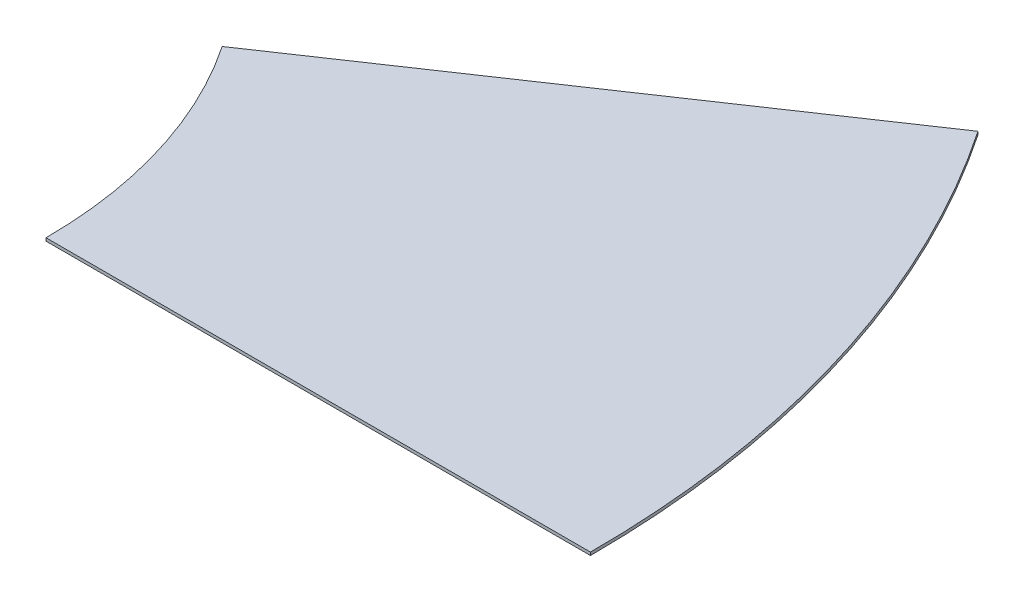
ISO-10303-21;
HEADER;
FILE_DESCRIPTION(('STEP AP214'),'2;1');
FILE_NAME('part.step','',(''),(''),'','','');
FILE_SCHEMA(('AUTOMOTIVE_DESIGN { 1 0 10303 214 1 1 1 1 }'));
ENDSEC;
DATA;
#1=APPLICATION_CONTEXT('core data for automotive mechanical design processes');
#2=APPLICATION_PROTOCOL_DEFINITION('international standard','automotive_design',2000,#1);
#3=PRODUCT_CONTEXT('',#1,'mechanical');
#4=PRODUCT('Part','Part','',(#3));
#5=PRODUCT_RELATED_PRODUCT_CATEGORY('part','',(#4));
#6=PRODUCT_DEFINITION_FORMATION('','',#4);
#7=PRODUCT_DEFINITION_CONTEXT('part definition',#1,'design');
#8=PRODUCT_DEFINITION('design','',#6,#7);
#9=PRODUCT_DEFINITION_SHAPE('','',#8);
#10=(LENGTH_UNIT() NAMED_UNIT(*) SI_UNIT(.MILLI.,.METRE.));
#11=(NAMED_UNIT(*) PLANE_ANGLE_UNIT() SI_UNIT($,.RADIAN.));
#12=(NAMED_UNIT(*) SI_UNIT($,.STERADIAN.) SOLID_ANGLE_UNIT());
#13=UNCERTAINTY_MEASURE_WITH_UNIT(LENGTH_MEASURE(1.E-05),#10,'distance_accuracy_value','');
#14=(GEOMETRIC_REPRESENTATION_CONTEXT(3) GLOBAL_UNCERTAINTY_ASSIGNED_CONTEXT((#13)) GLOBAL_UNIT_ASSIGNED_CONTEXT((#10,
#11,#12)) REPRESENTATION_CONTEXT('',''));
#15=CARTESIAN_POINT('',(0.,0.,0.));
#16=DIRECTION('',(0.,0.,1.));
#17=DIRECTION('',(1.,0.,0.));
#18=AXIS2_PLACEMENT_3D('',#15,#16,#17);
#19=CARTESIAN_POINT('',(0.,0.33,0.));
#20=DIRECTION('',(0.,-1.,0.));
#21=DIRECTION('',(0.,0.,-1.));
#22=AXIS2_PLACEMENT_3D('',#19,#20,#21);
#23=CYLINDRICAL_SURFACE('',#22,110.);
#24=CARTESIAN_POINT('',(0.,0.,0.));
#25=DIRECTION('',(0.,1.,0.));
#26=DIRECTION('',(0.,0.,1.));
#27=AXIS2_PLACEMENT_3D('',#24,#25,#26);
#28=CIRCLE('',#27,110.);
#29=CARTESIAN_POINT('',(110.,0.,0.));
#30=VERTEX_POINT('',#29);
#31=CARTESIAN_POINT('',(91.1941329810549,0.,-61.5112193817816));
#32=VERTEX_POINT('',#31);
#33=EDGE_CURVE('E97',#30,#32,#28,.T.);
#34=ORIENTED_EDGE('',*,*,#33,.T.);
#35=DIRECTION('',(0.,-1.,0.));
#36=VECTOR('',#35,1.);
#37=CARTESIAN_POINT('',(91.1941329810549,0.33,-61.5112193817816));
#38=LINE('',#37,#36);
#39=CARTESIAN_POINT('',(91.1941329810549,0.33,-61.5112193817816));
#40=VERTEX_POINT('',#39);
#41=EDGE_CURVE('E11',#40,#32,#38,.T.);
#42=ORIENTED_EDGE('',*,*,#41,.F.);
#43=CARTESIAN_POINT('',(0.,0.33,0.));
#44=DIRECTION('',(0.,1.,0.));
#45=DIRECTION('',(0.,0.,1.));
#46=AXIS2_PLACEMENT_3D('',#43,#44,#45);
#47=CIRCLE('',#46,110.);
#48=CARTESIAN_POINT('',(110.,0.33,0.));
#49=VERTEX_POINT('',#48);
#50=EDGE_CURVE('E83',#49,#40,#47,.T.);
#51=ORIENTED_EDGE('',*,*,#50,.F.);
#52=DIRECTION('',(0.,-1.,0.));
#53=VECTOR('',#52,1.);
#54=CARTESIAN_POINT('',(110.,0.33,0.));
#55=LINE('',#54,#53);
#56=EDGE_CURVE('E50',#49,#30,#55,.T.);
#57=ORIENTED_EDGE('',*,*,#56,.T.);
#58=EDGE_LOOP('',(#34,#42,#51,#57));
#59=FACE_BOUND('',#58,.T.);
#60=ADVANCED_FACE('F34',(#59),#23,.T.);
#61=CARTESIAN_POINT('',(91.1941329810549,0.33,-61.5112193817816));
#62=DIRECTION('',(0.559192903470742,0.,0.829037572555045));
#63=DIRECTION('',(0.829037572555045,0.,-0.559192903470742));
#64=AXIS2_PLACEMENT_3D('',#61,#62,#63);
#65=PLANE('',#64);
#66=DIRECTION('',(-0.829037572555045,0.,0.559192903470742));
#67=VECTOR('',#66,1.);
#68=CARTESIAN_POINT('',(91.1941329810549,0.,-61.5112193817816));
#69=LINE('',#68,#67);
#70=CARTESIAN_POINT('',(41.4518786277522,0.,-27.9596451735371));
#71=VERTEX_POINT('',#70);
#72=EDGE_CURVE('E88',#32,#71,#69,.T.);
#73=ORIENTED_EDGE('',*,*,#72,.T.);
#74=DIRECTION('',(0.,-1.,0.));
#75=VECTOR('',#74,1.);
#76=CARTESIAN_POINT('',(41.4518786277522,0.33,-27.9596451735371));
#77=LINE('',#76,#75);
#78=CARTESIAN_POINT('',(41.4518786277522,0.33,-27.9596451735371));
#79=VERTEX_POINT('',#78);
#80=EDGE_CURVE('E42',#79,#71,#77,.T.);
#81=ORIENTED_EDGE('',*,*,#80,.F.);
#82=DIRECTION('',(-0.829037572555045,0.,0.559192903470742));
#83=VECTOR('',#82,1.);
#84=CARTESIAN_POINT('',(91.1941329810549,0.33,-61.5112193817816));
#85=LINE('',#84,#83);
#86=EDGE_CURVE('E75',#40,#79,#85,.T.);
#87=ORIENTED_EDGE('',*,*,#86,.F.);
#88=ORIENTED_EDGE('',*,*,#41,.T.);
#89=EDGE_LOOP('',(#73,#81,#87,#88));
#90=FACE_BOUND('',#89,.T.);
#91=ADVANCED_FACE('F87',(#90),#65,.F.);
#92=CARTESIAN_POINT('',(0.,0.33,0.));
#93=DIRECTION('',(0.,-1.,0.));
#94=DIRECTION('',(0.,0.,-1.));
#95=AXIS2_PLACEMENT_3D('',#92,#93,#94);
#96=CYLINDRICAL_SURFACE('',#95,50.);
#97=CARTESIAN_POINT('',(0.,0.,0.));
#98=DIRECTION('',(0.,1.,0.));
#99=DIRECTION('',(0.,0.,1.));
#100=AXIS2_PLACEMENT_3D('',#97,#98,#99);
#101=CIRCLE('',#100,50.);
#102=CARTESIAN_POINT('',(50.,0.,0.));
#103=VERTEX_POINT('',#102);
#104=EDGE_CURVE('E100',#103,#71,#101,.T.);
#105=ORIENTED_EDGE('',*,*,#104,.F.);
#106=DIRECTION('',(0.,-1.,0.));
#107=VECTOR('',#106,1.);
#108=CARTESIAN_POINT('',(50.,0.33,0.));
#109=LINE('',#108,#107);
#110=CARTESIAN_POINT('',(50.,0.33,0.));
#111=VERTEX_POINT('',#110);
#112=EDGE_CURVE('E64',#111,#103,#109,.T.);
#113=ORIENTED_EDGE('',*,*,#112,.F.);
#114=CARTESIAN_POINT('',(0.,0.33,0.));
#115=DIRECTION('',(0.,1.,0.));
#116=DIRECTION('',(0.,0.,1.));
#117=AXIS2_PLACEMENT_3D('',#114,#115,#116);
#118=CIRCLE('',#117,50.);
#119=EDGE_CURVE('E82',#111,#79,#118,.T.);
#120=ORIENTED_EDGE('',*,*,#119,.T.);
#121=ORIENTED_EDGE('',*,*,#80,.T.);
#122=EDGE_LOOP('',(#105,#113,#120,#121));
#123=FACE_BOUND('',#122,.T.);
#124=ADVANCED_FACE('F91',(#123),#96,.F.);
#125=CARTESIAN_POINT('',(110.,0.33,0.));
#126=DIRECTION('',(0.,0.,1.));
#127=DIRECTION('',(1.,0.,0.));
#128=AXIS2_PLACEMENT_3D('',#125,#126,#127);
#129=PLANE('',#128);
#130=DIRECTION('',(-1.,0.,0.));
#131=VECTOR('',#130,1.);
#132=CARTESIAN_POINT('',(110.,0.,0.));
#133=LINE('',#132,#131);
#134=EDGE_CURVE('E102',#30,#103,#133,.T.);
#135=ORIENTED_EDGE('',*,*,#134,.F.);
#136=ORIENTED_EDGE('',*,*,#56,.F.);
#137=DIRECTION('',(-1.,0.,0.));
#138=VECTOR('',#137,1.);
#139=CARTESIAN_POINT('',(110.,0.33,0.));
#140=LINE('',#139,#138);
#141=EDGE_CURVE('E92',#49,#111,#140,.T.);
#142=ORIENTED_EDGE('',*,*,#141,.T.);
#143=ORIENTED_EDGE('',*,*,#112,.T.);
#144=EDGE_LOOP('',(#135,#136,#142,#143));
#145=FACE_BOUND('',#144,.T.);
#146=ADVANCED_FACE('F108',(#145),#129,.T.);
#147=CARTESIAN_POINT('',(0.,0.33,0.));
#148=DIRECTION('',(0.,1.,0.));
#149=DIRECTION('',(0.,0.,1.));
#150=AXIS2_PLACEMENT_3D('',#147,#148,#149);
#151=PLANE('',#150);
#152=ORIENTED_EDGE('',*,*,#50,.T.);
#153=ORIENTED_EDGE('',*,*,#86,.T.);
#154=ORIENTED_EDGE('',*,*,#119,.F.);
#155=ORIENTED_EDGE('',*,*,#141,.F.);
#156=EDGE_LOOP('',(#152,#153,#154,#155));
#157=FACE_BOUND('',#156,.T.);
#158=ADVANCED_FACE('F79',(#157),#151,.T.);
#159=CARTESIAN_POINT('',(0.,0.,0.));
#160=DIRECTION('',(0.,1.,0.));
#161=DIRECTION('',(0.,0.,1.));
#162=AXIS2_PLACEMENT_3D('',#159,#160,#161);
#163=PLANE('',#162);
#164=ORIENTED_EDGE('',*,*,#33,.F.);
#165=ORIENTED_EDGE('',*,*,#134,.T.);
#166=ORIENTED_EDGE('',*,*,#104,.T.);
#167=ORIENTED_EDGE('',*,*,#72,.F.);
#168=EDGE_LOOP('',(#164,#165,#166,#167));
#169=FACE_BOUND('',#168,.T.);
#170=ADVANCED_FACE('F107',(#169),#163,.F.);
#171=CLOSED_SHELL('',(#60,#91,#124,#146,#158,#170));
#172=MANIFOLD_SOLID_BREP('B2',#171);
#173=ADVANCED_BREP_SHAPE_REPRESENTATION('',(#18,#172),#14);
#174=SHAPE_DEFINITION_REPRESENTATION(#9,#173);
ENDSEC;
END-ISO-10303-21;
